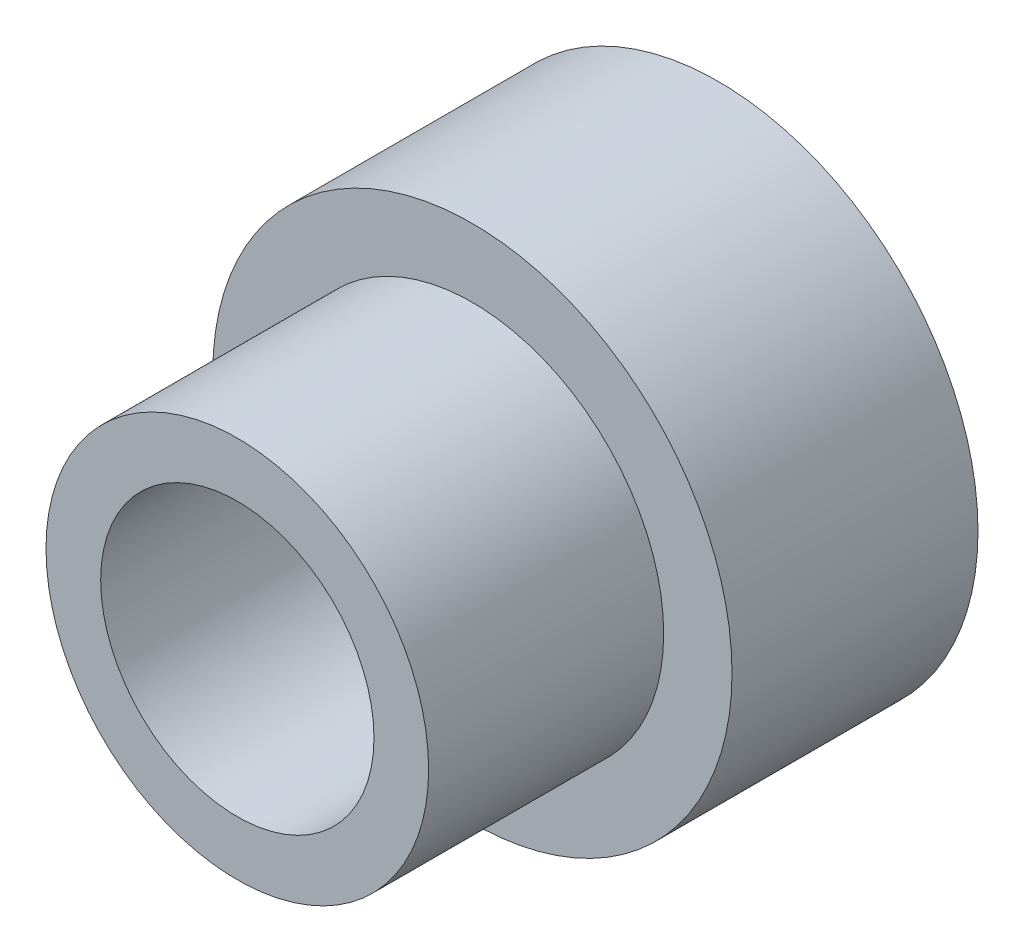
ISO-10303-21;
HEADER;
FILE_DESCRIPTION(('STEP AP214'),'2;1');
FILE_NAME('part.step','',(''),(''),'','','');
FILE_SCHEMA(('AUTOMOTIVE_DESIGN { 1 0 10303 214 1 1 1 1 }'));
ENDSEC;
DATA;
#1=APPLICATION_CONTEXT('core data for automotive mechanical design processes');
#2=APPLICATION_PROTOCOL_DEFINITION('international standard','automotive_design',2000,#1);
#3=PRODUCT_CONTEXT('',#1,'mechanical');
#4=PRODUCT('Part','Part','',(#3));
#5=PRODUCT_RELATED_PRODUCT_CATEGORY('part','',(#4));
#6=PRODUCT_DEFINITION_FORMATION('','',#4);
#7=PRODUCT_DEFINITION_CONTEXT('part definition',#1,'design');
#8=PRODUCT_DEFINITION('design','',#6,#7);
#9=PRODUCT_DEFINITION_SHAPE('','',#8);
#10=(LENGTH_UNIT() NAMED_UNIT(*) SI_UNIT(.MILLI.,.METRE.));
#11=(NAMED_UNIT(*) PLANE_ANGLE_UNIT() SI_UNIT($,.RADIAN.));
#12=(NAMED_UNIT(*) SI_UNIT($,.STERADIAN.) SOLID_ANGLE_UNIT());
#13=UNCERTAINTY_MEASURE_WITH_UNIT(LENGTH_MEASURE(1.E-05),#10,'distance_accuracy_value','');
#14=(GEOMETRIC_REPRESENTATION_CONTEXT(3) GLOBAL_UNCERTAINTY_ASSIGNED_CONTEXT((#13)) GLOBAL_UNIT_ASSIGNED_CONTEXT((#10,
#11,#12)) REPRESENTATION_CONTEXT('',''));
#15=CARTESIAN_POINT('',(0.,0.,0.));
#16=DIRECTION('',(0.,0.,1.));
#17=DIRECTION('',(1.,0.,0.));
#18=AXIS2_PLACEMENT_3D('',#15,#16,#17);
#19=CARTESIAN_POINT('',(0.,0.,8.8));
#20=DIRECTION('',(0.,0.,-1.));
#21=DIRECTION('',(-1.,0.,0.));
#22=AXIS2_PLACEMENT_3D('',#19,#20,#21);
#23=CYLINDRICAL_SURFACE('',#22,4.75);
#24=CARTESIAN_POINT('',(-4.75,0.,3.49964366117878));
#25=CARTESIAN_POINT('',(-4.74999891000432,-0.0690442514355837,3.49799297098812));
#26=CARTESIAN_POINT('',(-4.74847974099882,-0.137970502863256,3.49060434640745));
#27=CARTESIAN_POINT('',(-4.74260231474112,-0.273564940427279,3.46459568027942));
#28=CARTESIAN_POINT('',(-4.73824254619214,-0.340231904670816,3.44596966044144));
#29=CARTESIAN_POINT('',(-4.72719984845734,-0.46933605010888,3.3981284727636));
#30=CARTESIAN_POINT('',(-4.72052000528746,-0.531778719025767,3.36892736903786));
#31=CARTESIAN_POINT('',(-4.70557556407437,-0.650897195168484,3.30080506216222));
#32=CARTESIAN_POINT('',(-4.69731088002504,-0.707572689165806,3.26188333145892));
#33=CARTESIAN_POINT('',(-4.67990733295633,-0.814853006896146,3.17446577887383));
#34=CARTESIAN_POINT('',(-4.67075383533434,-0.86530660605783,3.12578724510292));
#35=CARTESIAN_POINT('',(-4.65274638055937,-0.95742313979145,3.02066519897272));
#36=CARTESIAN_POINT('',(-4.64389245609363,-0.999085117666456,2.96422084264598));
#37=CARTESIAN_POINT('',(-4.62738216207192,-1.07298326458697,2.84417781481729));
#38=CARTESIAN_POINT('',(-4.61974436693425,-1.10507876962353,2.7804897636522));
#39=CARTESIAN_POINT('',(-4.60675808448116,-1.15802805984088,2.64838214603508));
#40=CARTESIAN_POINT('',(-4.60140914403866,-1.17888407032908,2.57996351921861));
#41=CARTESIAN_POINT('',(-4.59377937834712,-1.20827073429202,2.4421027225414));
#42=CARTESIAN_POINT('',(-4.59142721096501,-1.21708835885798,2.37272574081345));
#43=CARTESIAN_POINT('',(-4.58985185848074,-1.22301710532177,2.23344360430024));
#44=CARTESIAN_POINT('',(-4.59062816410688,-1.22013013256405,2.16353853732899));
#45=CARTESIAN_POINT('',(-4.59515077132983,-1.20298059397002,2.02704075179432));
#46=CARTESIAN_POINT('',(-4.59882176289799,-1.18900642360233,1.96040895268843));
#47=CARTESIAN_POINT('',(-4.6086036450214,-1.15050578316468,1.83045897549149));
#48=CARTESIAN_POINT('',(-4.61471476192335,-1.12597833415329,1.76714110541786));
#49=CARTESIAN_POINT('',(-4.62877827125725,-1.0666996175293,1.64460685374193));
#50=CARTESIAN_POINT('',(-4.6367552762614,-1.03180983828533,1.58546041760137));
#51=CARTESIAN_POINT('',(-4.65360904096037,-0.952914538786377,1.47373618464245));
#52=CARTESIAN_POINT('',(-4.66248597333612,-0.908907267340728,1.42115965281582));
#53=CARTESIAN_POINT('',(-4.68045457487104,-0.811401979411775,1.32235505805912));
#54=CARTESIAN_POINT('',(-4.68954430819622,-0.757650800332188,1.27637609014341));
#55=CARTESIAN_POINT('',(-4.70662523276125,-0.643062574426104,1.19404066572519));
#56=CARTESIAN_POINT('',(-4.71461640844014,-0.582225427250045,1.15768434551989));
#57=CARTESIAN_POINT('',(-4.72858748950934,-0.455030633582151,1.0956431556623));
#58=CARTESIAN_POINT('',(-4.73456534999075,-0.388667459139005,1.06996912974381));
#59=CARTESIAN_POINT('',(-4.74378155207311,-0.252378567161095,1.03020221193939));
#60=CARTESIAN_POINT('',(-4.74702048926213,-0.182453627652324,1.01610680226349));
#61=CARTESIAN_POINT('',(-4.75029918246828,-0.0432080622062993,1.00022839429106));
#62=CARTESIAN_POINT('',(-4.75042912181888,0.0260711316400462,0.99809969015378));
#63=CARTESIAN_POINT('',(-4.74766995281537,0.163965624258031,1.00530111233283));
#64=CARTESIAN_POINT('',(-4.74478109584352,0.232580977829043,1.01463028453623));
#65=CARTESIAN_POINT('',(-4.73632914813385,0.366208905396595,1.04421080126813));
#66=CARTESIAN_POINT('',(-4.73080448320104,0.43125872459454,1.06430570080481));
#67=CARTESIAN_POINT('',(-4.71764702440442,0.557055046472667,1.1146832591216));
#68=CARTESIAN_POINT('',(-4.71001397950216,0.61780103562586,1.1449671311657));
#69=CARTESIAN_POINT('',(-4.69321741205471,0.734693363027422,1.21560417314434));
#70=CARTESIAN_POINT('',(-4.68402472614515,0.790714006452704,1.2561582779603));
#71=CARTESIAN_POINT('',(-4.66517074212523,0.895270601613873,1.34589785749307));
#72=CARTESIAN_POINT('',(-4.65550935626212,0.94380514459333,1.39508495307734));
#73=CARTESIAN_POINT('',(-4.636476746808,1.03331292918191,1.50222723845445));
#74=CARTESIAN_POINT('',(-4.62711966293772,1.07405594855623,1.56037765206571));
#75=CARTESIAN_POINT('',(-4.61002769716132,1.14520263261106,1.68291380579634));
#76=CARTESIAN_POINT('',(-4.60229270182805,1.1756070203295,1.74729910947044));
#77=CARTESIAN_POINT('',(-4.58941989817137,1.22489697823498,1.87992398952328));
#78=CARTESIAN_POINT('',(-4.58425926647332,1.24388409081398,1.94812350873291));
#79=CARTESIAN_POINT('',(-4.57706442915304,1.27010639584556,2.08690071739952));
#80=CARTESIAN_POINT('',(-4.57502946830664,1.27734442713368,2.1574778281701));
#81=CARTESIAN_POINT('',(-4.57435058425785,1.27977206783591,2.29659766214816));
#82=CARTESIAN_POINT('',(-4.57560072326222,1.27533806837593,2.36513358743603));
#83=CARTESIAN_POINT('',(-4.58111857816932,1.25537164460877,2.50043988412651));
#84=CARTESIAN_POINT('',(-4.58538627983532,1.23983927266324,2.56721026385736));
#85=CARTESIAN_POINT('',(-4.59642160258139,1.19827558420131,2.69686410562288));
#86=CARTESIAN_POINT('',(-4.60317891521233,1.17228752012647,2.75976236453443));
#87=CARTESIAN_POINT('',(-4.61845271329504,1.11058569371893,2.88035887729869));
#88=CARTESIAN_POINT('',(-4.6269694812077,1.07487036948977,2.93805629407544));
#89=CARTESIAN_POINT('',(-4.64513910633576,0.993463158836126,3.0484713920328));
#90=CARTESIAN_POINT('',(-4.65481836189149,0.947504360484621,3.1009880132408));
#91=CARTESIAN_POINT('',(-4.6740646125765,0.847472643993664,3.19766955315449));
#92=CARTESIAN_POINT('',(-4.68363158158507,0.793397876687111,3.24183256335144));
#93=CARTESIAN_POINT('',(-4.70181157432806,0.677471840700378,3.32132593969066));
#94=CARTESIAN_POINT('',(-4.7104041538435,0.61549733788172,3.3564816171918));
#95=CARTESIAN_POINT('',(-4.72548907902328,0.486282548930466,3.41579787515038));
#96=CARTESIAN_POINT('',(-4.73198286268575,0.419045907573168,3.43996598841665));
#97=CARTESIAN_POINT('',(-4.74128310580491,0.293255132072887,3.47334079838062));
#98=CARTESIAN_POINT('',(-4.74453428611579,0.235223142591517,3.48441783916297));
#99=CARTESIAN_POINT('',(-4.74889310931479,0.11809864823881,3.49827427553013));
#100=CARTESIAN_POINT('',(-4.75000093152634,0.0590062325052679,3.50105436528751));
#101=CARTESIAN_POINT('',(-4.75,0.,3.49964366117878));
#102=B_SPLINE_CURVE_WITH_KNOTS('',3,(#24,#25,#26,#27,#28,#29,#30,#31,#32,#33,#34,#35,#36,#37,
#38,#39,#40,#41,#42,#43,#44,#45,#46,#47,#48,#49,#50,#51,#52,#53,#54,#55,#56,#57,#58,#59,#60,#61,
#62,#63,#64,#65,#66,#67,#68,#69,#70,#71,#72,#73,#74,#75,#76,#77,#78,#79,#80,#81,#82,#83,#84,#85,
#86,#87,#88,#89,#90,#91,#92,#93,#94,#95,#96,#97,#98,#99,#100,#101),.UNSPECIFIED.,.T.,.F.,(4,2,2,
2,2,2,2,2,2,2,2,2,2,2,2,2,2,2,2,2,2,2,2,2,2,2,2,2,2,2,2,2,2,2,2,2,2,2,4),(0.,0.206974816467836,
0.414059840684983,0.620870461814539,0.82769230931525,1.03882671072749,1.24998407577562,
1.46410834560227,1.67819020537716,1.88707403601082,2.09592386464908,2.29951254149228,
2.50312010766633,2.70958214131317,2.91608386680906,3.12902507219085,3.34196929355507,
3.55512915303268,3.76824264825396,3.9751665788995,4.18207327987629,4.38605172678111,
4.59005447126304,4.79840708307695,5.00679885558828,5.2206257318427,5.43443765091882,
5.64631871834405,5.85814858303511,6.06323182538042,6.2683141001584,6.47255658616519,
6.67683188653836,6.88722915849408,7.0976744409828,7.3119358338155,7.52605011187363,
7.70294863419355,7.8798323557099),.UNSPECIFIED.);
#103=CARTESIAN_POINT('',(-4.75,0.,3.49964366117878));
#104=VERTEX_POINT('',#103);
#105=EDGE_CURVE('E58',#104,#104,#102,.T.);
#106=ORIENTED_EDGE('',*,*,#105,.T.);
#107=EDGE_LOOP('',(#106));
#108=FACE_BOUND('',#107,.T.);
#109=CARTESIAN_POINT('',(0.,0.,0.));
#110=DIRECTION('',(0.,0.,1.));
#111=DIRECTION('',(1.,0.,0.));
#112=AXIS2_PLACEMENT_3D('',#109,#110,#111);
#113=CIRCLE('',#112,4.75);
#114=CARTESIAN_POINT('',(4.75,0.,0.));
#115=VERTEX_POINT('',#114);
#116=EDGE_CURVE('E10',#115,#115,#113,.T.);
#117=ORIENTED_EDGE('',*,*,#116,.T.);
#118=EDGE_LOOP('',(#117));
#119=FACE_BOUND('',#118,.T.);
#120=CARTESIAN_POINT('',(0.,0.,4.5));
#121=DIRECTION('',(0.,0.,1.));
#122=DIRECTION('',(1.,0.,0.));
#123=AXIS2_PLACEMENT_3D('',#120,#121,#122);
#124=CIRCLE('',#123,4.75);
#125=CARTESIAN_POINT('',(4.75,0.,4.5));
#126=VERTEX_POINT('',#125);
#127=EDGE_CURVE('E42',#126,#126,#124,.T.);
#128=ORIENTED_EDGE('',*,*,#127,.F.);
#129=EDGE_LOOP('',(#128));
#130=FACE_BOUND('',#129,.T.);
#131=ADVANCED_FACE('F30',(#108,#119,#130),#23,.T.);
#132=CARTESIAN_POINT('',(0.,0.,0.));
#133=DIRECTION('',(0.,0.,1.));
#134=DIRECTION('',(1.,0.,0.));
#135=AXIS2_PLACEMENT_3D('',#132,#133,#134);
#136=PLANE('',#135);
#137=CARTESIAN_POINT('',(0.,0.,0.));
#138=DIRECTION('',(0.,0.,-1.));
#139=DIRECTION('',(-1.,0.,0.));
#140=AXIS2_PLACEMENT_3D('',#137,#138,#139);
#141=CIRCLE('',#140,2.5);
#142=CARTESIAN_POINT('',(-2.5,0.,0.));
#143=VERTEX_POINT('',#142);
#144=EDGE_CURVE('E55',#143,#143,#141,.T.);
#145=ORIENTED_EDGE('',*,*,#144,.F.);
#146=EDGE_LOOP('',(#145));
#147=FACE_BOUND('',#146,.T.);
#148=ORIENTED_EDGE('',*,*,#116,.F.);
#149=EDGE_LOOP('',(#148));
#150=FACE_BOUND('',#149,.T.);
#151=ADVANCED_FACE('F82',(#147,#150),#136,.F.);
#152=CARTESIAN_POINT('',(0.,0.,4.5));
#153=DIRECTION('',(0.,0.,1.));
#154=DIRECTION('',(1.,0.,0.));
#155=AXIS2_PLACEMENT_3D('',#152,#153,#154);
#156=PLANE('',#155);
#157=CARTESIAN_POINT('',(0.,0.,4.5));
#158=DIRECTION('',(0.,0.,1.));
#159=DIRECTION('',(1.,0.,0.));
#160=AXIS2_PLACEMENT_3D('',#157,#158,#159);
#161=CIRCLE('',#160,3.5);
#162=CARTESIAN_POINT('',(3.5,0.,4.5));
#163=VERTEX_POINT('',#162);
#164=EDGE_CURVE('E46',#163,#163,#161,.T.);
#165=ORIENTED_EDGE('',*,*,#164,.F.);
#166=EDGE_LOOP('',(#165));
#167=FACE_BOUND('',#166,.T.);
#168=ORIENTED_EDGE('',*,*,#127,.T.);
#169=EDGE_LOOP('',(#168));
#170=FACE_BOUND('',#169,.T.);
#171=ADVANCED_FACE('F78',(#167,#170),#156,.T.);
#172=CARTESIAN_POINT('',(0.,0.,4.5));
#173=DIRECTION('',(0.,0.,1.));
#174=DIRECTION('',(1.,0.,0.));
#175=AXIS2_PLACEMENT_3D('',#172,#173,#174);
#176=CYLINDRICAL_SURFACE('',#175,3.5);
#177=CARTESIAN_POINT('',(0.,0.,8.8));
#178=DIRECTION('',(0.,0.,1.));
#179=DIRECTION('',(1.,0.,0.));
#180=AXIS2_PLACEMENT_3D('',#177,#178,#179);
#181=CIRCLE('',#180,3.5);
#182=CARTESIAN_POINT('',(3.5,0.,8.8));
#183=VERTEX_POINT('',#182);
#184=EDGE_CURVE('E49',#183,#183,#181,.T.);
#185=CARTESIAN_POINT('',(3.5,0.,4.5));
#186=CARTESIAN_POINT('',(3.5,0.,4.54479166666667));
#187=CARTESIAN_POINT('',(3.5,0.,4.58958333333333));
#188=CARTESIAN_POINT('',(3.5,0.,4.67916666666667));
#189=CARTESIAN_POINT('',(3.5,0.,4.72395833333333));
#190=CARTESIAN_POINT('',(3.5,0.,4.81354166666667));
#191=CARTESIAN_POINT('',(3.5,0.,4.85833333333333));
#192=CARTESIAN_POINT('',(3.5,0.,4.94791666666667));
#193=CARTESIAN_POINT('',(3.5,0.,4.99270833333333));
#194=CARTESIAN_POINT('',(3.5,0.,5.08229166666667));
#195=CARTESIAN_POINT('',(3.5,0.,5.12708333333333));
#196=CARTESIAN_POINT('',(3.5,0.,5.21666666666667));
#197=CARTESIAN_POINT('',(3.5,0.,5.26145833333333));
#198=CARTESIAN_POINT('',(3.5,0.,5.35104166666667));
#199=CARTESIAN_POINT('',(3.5,0.,5.39583333333333));
#200=CARTESIAN_POINT('',(3.5,0.,5.48541666666667));
#201=CARTESIAN_POINT('',(3.5,0.,5.53020833333333));
#202=CARTESIAN_POINT('',(3.5,0.,5.61979166666667));
#203=CARTESIAN_POINT('',(3.5,0.,5.66458333333333));
#204=CARTESIAN_POINT('',(3.5,0.,5.75416666666667));
#205=CARTESIAN_POINT('',(3.5,0.,5.79895833333333));
#206=CARTESIAN_POINT('',(3.5,0.,5.88854166666667));
#207=CARTESIAN_POINT('',(3.5,0.,5.93333333333333));
#208=CARTESIAN_POINT('',(3.5,0.,6.02291666666667));
#209=CARTESIAN_POINT('',(3.5,0.,6.06770833333333));
#210=CARTESIAN_POINT('',(3.5,0.,6.15729166666667));
#211=CARTESIAN_POINT('',(3.5,0.,6.20208333333333));
#212=CARTESIAN_POINT('',(3.5,0.,6.29166666666667));
#213=CARTESIAN_POINT('',(3.5,0.,6.33645833333333));
#214=CARTESIAN_POINT('',(3.5,0.,6.42604166666667));
#215=CARTESIAN_POINT('',(3.5,0.,6.47083333333333));
#216=CARTESIAN_POINT('',(3.5,0.,6.56041666666667));
#217=CARTESIAN_POINT('',(3.5,0.,6.60520833333333));
#218=CARTESIAN_POINT('',(3.5,0.,6.69479166666667));
#219=CARTESIAN_POINT('',(3.5,0.,6.73958333333333));
#220=CARTESIAN_POINT('',(3.5,0.,6.82916666666667));
#221=CARTESIAN_POINT('',(3.5,0.,6.87395833333333));
#222=CARTESIAN_POINT('',(3.5,0.,6.96354166666667));
#223=CARTESIAN_POINT('',(3.5,0.,7.00833333333333));
#224=CARTESIAN_POINT('',(3.5,0.,7.09791666666667));
#225=CARTESIAN_POINT('',(3.5,0.,7.14270833333333));
#226=CARTESIAN_POINT('',(3.5,0.,7.23229166666667));
#227=CARTESIAN_POINT('',(3.5,0.,7.27708333333333));
#228=CARTESIAN_POINT('',(3.5,0.,7.36666666666667));
#229=CARTESIAN_POINT('',(3.5,0.,7.41145833333333));
#230=CARTESIAN_POINT('',(3.5,0.,7.50104166666667));
#231=CARTESIAN_POINT('',(3.5,0.,7.54583333333333));
#232=CARTESIAN_POINT('',(3.5,0.,7.63541666666667));
#233=CARTESIAN_POINT('',(3.5,0.,7.68020833333333));
#234=CARTESIAN_POINT('',(3.5,0.,7.76979166666667));
#235=CARTESIAN_POINT('',(3.5,0.,7.81458333333333));
#236=CARTESIAN_POINT('',(3.5,0.,7.90416666666667));
#237=CARTESIAN_POINT('',(3.5,0.,7.94895833333333));
#238=CARTESIAN_POINT('',(3.5,0.,8.03854166666667));
#239=CARTESIAN_POINT('',(3.5,0.,8.08333333333333));
#240=CARTESIAN_POINT('',(3.5,0.,8.17291666666667));
#241=CARTESIAN_POINT('',(3.5,0.,8.21770833333333));
#242=CARTESIAN_POINT('',(3.5,0.,8.30729166666667));
#243=CARTESIAN_POINT('',(3.5,0.,8.35208333333333));
#244=CARTESIAN_POINT('',(3.5,0.,8.44166666666667));
#245=CARTESIAN_POINT('',(3.5,0.,8.48645833333333));
#246=CARTESIAN_POINT('',(3.5,0.,8.57604166666667));
#247=CARTESIAN_POINT('',(3.5,0.,8.62083333333333));
#248=CARTESIAN_POINT('',(3.5,0.,8.71041666666667));
#249=CARTESIAN_POINT('',(3.5,0.,8.75520833333333));
#250=CARTESIAN_POINT('',(3.5,0.,8.8));
#251=B_SPLINE_CURVE_WITH_KNOTS('',3,(#185,#186,#187,#188,#189,#190,#191,#192,#193,#194,#195,
#196,#197,#198,#199,#200,#201,#202,#203,#204,#205,#206,#207,#208,#209,#210,#211,#212,#213,#214,
#215,#216,#217,#218,#219,#220,#221,#222,#223,#224,#225,#226,#227,#228,#229,#230,#231,#232,#233,
#234,#235,#236,#237,#238,#239,#240,#241,#242,#243,#244,#245,#246,#247,#248,#249,#250),
.UNSPECIFIED.,.F.,.F.,(4,2,2,2,2,2,2,2,2,2,2,2,2,2,2,2,2,2,2,2,2,2,2,2,2,2,2,2,2,2,2,2,4),(0.,
0.134375,0.26875,0.403125,0.5375,0.671875,0.80625,0.940625,1.075,1.209375,1.34375,1.478125,
1.6125,1.746875,1.88125,2.015625,2.15,2.284375,2.41875,2.553125,2.6875,2.821875,2.95625,
3.090625,3.225,3.359375,3.49375,3.628125,3.7625,3.896875,4.03125,4.165625,4.3),.UNSPECIFIED.);
#252=EDGE_CURVE('BSEAM75',#163,#183,#251,.T.);
#253=ORIENTED_EDGE('',*,*,#164,.T.);
#254=ORIENTED_EDGE('',*,*,#184,.F.);
#255=ORIENTED_EDGE('',*,*,#252,.T.);
#256=ORIENTED_EDGE('',*,*,#252,.F.);
#257=EDGE_LOOP('',(#253,#255,#254,#256));
#258=FACE_BOUND('',#257,.T.);
#259=ADVANCED_FACE('F75',(#258),#176,.T.);
#260=CARTESIAN_POINT('',(0.,0.,8.8));
#261=DIRECTION('',(0.,0.,1.));
#262=DIRECTION('',(1.,0.,0.));
#263=AXIS2_PLACEMENT_3D('',#260,#261,#262);
#264=PLANE('',#263);
#265=CARTESIAN_POINT('',(0.,0.,8.8));
#266=DIRECTION('',(0.,0.,-1.));
#267=DIRECTION('',(-1.,0.,0.));
#268=AXIS2_PLACEMENT_3D('',#265,#266,#267);
#269=CIRCLE('',#268,2.5);
#270=CARTESIAN_POINT('',(-2.5,0.,8.8));
#271=VERTEX_POINT('',#270);
#272=EDGE_CURVE('E52',#271,#271,#269,.T.);
#273=ORIENTED_EDGE('',*,*,#272,.T.);
#274=EDGE_LOOP('',(#273));
#275=FACE_BOUND('',#274,.T.);
#276=ORIENTED_EDGE('',*,*,#184,.T.);
#277=EDGE_LOOP('',(#276));
#278=FACE_BOUND('',#277,.T.);
#279=ADVANCED_FACE('F73',(#275,#278),#264,.T.);
#280=CARTESIAN_POINT('',(0.,0.,8.8));
#281=DIRECTION('',(0.,0.,-1.));
#282=DIRECTION('',(-1.,0.,0.));
#283=AXIS2_PLACEMENT_3D('',#280,#281,#282);
#284=CYLINDRICAL_SURFACE('',#283,2.5);
#285=CARTESIAN_POINT('',(-2.5,0.,3.4999013013582));
#286=CARTESIAN_POINT('',(-2.49999641787918,0.0655244964583082,3.50072062189757));
#287=CARTESIAN_POINT('',(-2.49739642895794,0.131190881601952,3.49636694862987));
#288=CARTESIAN_POINT('',(-2.48722086606118,0.26071533681036,3.47749289677184));
#289=CARTESIAN_POINT('',(-2.47963615147796,0.32456985959421,3.46295383776554));
#290=CARTESIAN_POINT('',(-2.4602547213889,0.448397288812737,3.42442210807163));
#291=CARTESIAN_POINT('',(-2.44847382815021,0.50838379004388,3.40046491502815));
#292=CARTESIAN_POINT('',(-2.42175636599082,0.623366118524366,3.3439768560715));
#293=CARTESIAN_POINT('',(-2.40682001377111,0.678362288113915,3.31144657887651));
#294=CARTESIAN_POINT('',(-2.37410834103402,0.78544585089068,3.23657773677057));
#295=CARTESIAN_POINT('',(-2.35621790414629,0.837173559573563,3.19377587326042));
#296=CARTESIAN_POINT('',(-2.31992116881156,0.933059017760903,3.10053651512305));
#297=CARTESIAN_POINT('',(-2.30151449373486,0.977211063874992,3.05009332099281));
#298=CARTESIAN_POINT('',(-2.26450160688225,1.06031430168917,2.93811603803585));
#299=CARTESIAN_POINT('',(-2.24600039100354,1.09855280211433,2.87601413446858));
#300=CARTESIAN_POINT('',(-2.21282358827217,1.16394332329908,2.74527781056667));
#301=CARTESIAN_POINT('',(-2.19814569366599,1.19110203744026,2.67664736517003));
#302=CARTESIAN_POINT('',(-2.17549221857354,1.23197291761182,2.53845459005825));
#303=CARTESIAN_POINT('',(-2.16720238830697,1.24632199028859,2.46913484372284));
#304=CARTESIAN_POINT('',(-2.15746842893806,1.26310469764839,2.32862382876361));
#305=CARTESIAN_POINT('',(-2.15601694845427,1.26555112803503,2.25743465267621));
#306=CARTESIAN_POINT('',(-2.15993373284504,1.25884440550886,2.12456270351741));
#307=CARTESIAN_POINT('',(-2.16449177676993,1.25106967571836,2.06277950506379));
#308=CARTESIAN_POINT('',(-2.17842929463424,1.22663825296095,1.94156140623131));
#309=CARTESIAN_POINT('',(-2.18781026627953,1.2099788008836,1.88212724149605));
#310=CARTESIAN_POINT('',(-2.21044295694306,1.16812308118952,1.76609436298961));
#311=CARTESIAN_POINT('',(-2.22375198682888,1.14279946300203,1.70955331439503));
#312=CARTESIAN_POINT('',(-2.25278827307131,1.08443813107083,1.60128528126553));
#313=CARTESIAN_POINT('',(-2.26851656571045,1.05139710844498,1.54956037502224));
#314=CARTESIAN_POINT('',(-2.30303891840378,0.973672050120659,1.44550643932181));
#315=CARTESIAN_POINT('',(-2.32196938285135,0.92804489296716,1.39392495962425));
#316=CARTESIAN_POINT('',(-2.35922103862622,0.828786413955799,1.29882729946938));
#317=CARTESIAN_POINT('',(-2.37754191158333,0.775150987449553,1.25531528081761));
#318=CARTESIAN_POINT('',(-2.41271223512403,0.657843969956093,1.1753920791324));
#319=CARTESIAN_POINT('',(-2.42943262466502,0.593791619294811,1.13947813509973));
#320=CARTESIAN_POINT('',(-2.45836171154674,0.45952056072862,1.07922206375283));
#321=CARTESIAN_POINT('',(-2.47057381906919,0.389306563621328,1.05487118582641));
#322=CARTESIAN_POINT('',(-2.48830688102563,0.250642722992025,1.02037678549208));
#323=CARTESIAN_POINT('',(-2.49428115986218,0.182493560515833,1.00926081259956));
#324=CARTESIAN_POINT('',(-2.50053860701548,0.0450487556870986,0.998446395893576));
#325=CARTESIAN_POINT('',(-2.50082470457567,-0.0242462781735562,0.998742075189383));
#326=CARTESIAN_POINT('',(-2.49592702800473,-0.156035066943597,1.01022910543365));
#327=CARTESIAN_POINT('',(-2.49118405294468,-0.218625393202112,1.02053674074606));
#328=CARTESIAN_POINT('',(-2.4773897456308,-0.341083824768653,1.05030336991299));
#329=CARTESIAN_POINT('',(-2.46833798954509,-0.400951661645076,1.0697632640243));
#330=CARTESIAN_POINT('',(-2.44650184721553,-0.51793433748314,1.1176667215702));
#331=CARTESIAN_POINT('',(-2.43363408406667,-0.574950306865459,1.14631226229624));
#332=CARTESIAN_POINT('',(-2.40539128763999,-0.68355414526693,1.21154435153647));
#333=CARTESIAN_POINT('',(-2.39001524686957,-0.735139819359562,1.24813409293723));
#334=CARTESIAN_POINT('',(-2.35647955814078,-0.836741704636031,1.33231398454555));
#335=CARTESIAN_POINT('',(-2.33819461432812,-0.886117968745219,1.38062768786899));
#336=CARTESIAN_POINT('',(-2.30197049053877,-0.976371712980453,1.48480198583723));
#337=CARTESIAN_POINT('',(-2.28403156981578,-1.01724302939055,1.54066800577071));
#338=CARTESIAN_POINT('',(-2.24957028471191,-1.09141983389096,1.66210832109736));
#339=CARTESIAN_POINT('',(-2.23317597265965,-1.12420027230785,1.72804313075633));
#340=CARTESIAN_POINT('',(-2.20535282890496,-1.17785577739228,1.86555028249036));
#341=CARTESIAN_POINT('',(-2.1939179683166,-1.19874530878189,1.93711565405225));
#342=CARTESIAN_POINT('',(-2.17870785806088,-1.22615572429347,2.07694391888215));
#343=CARTESIAN_POINT('',(-2.17433212632229,-1.23380766407749,2.14491791981865));
#344=CARTESIAN_POINT('',(-2.17203907304914,-1.23784307849482,2.28129408051491));
#345=CARTESIAN_POINT('',(-2.17411837484399,-1.23423244464991,2.34969599774554));
#346=CARTESIAN_POINT('',(-2.18385104524061,-1.21691134028526,2.4777116353777));
#347=CARTESIAN_POINT('',(-2.19092354763328,-1.20425177731009,2.53751796524111));
#348=CARTESIAN_POINT('',(-2.20909449829088,-1.1705832053046,2.65408208243197));
#349=CARTESIAN_POINT('',(-2.22019425142755,-1.14957148987762,2.71083887482622));
#350=CARTESIAN_POINT('',(-2.24597051701021,-1.09839973403535,2.82351607993992));
#351=CARTESIAN_POINT('',(-2.2608226018601,-1.06776370073913,2.87917881486552));
#352=CARTESIAN_POINT('',(-2.29216496975955,-0.998707729484282,2.98493883821842));
#353=CARTESIAN_POINT('',(-2.30865607167094,-0.960283890631704,3.03503331797099));
#354=CARTESIAN_POINT('',(-2.34383779581842,-0.871199377768762,3.13467682831682));
#355=CARTESIAN_POINT('',(-2.36254877009391,-0.819613853969502,3.18339608217809));
#356=CARTESIAN_POINT('',(-2.39819928571235,-0.708547772191328,3.27172517243595));
#357=CARTESIAN_POINT('',(-2.41513776482464,-0.649062527924951,3.31132956328393));
#358=CARTESIAN_POINT('',(-2.44563888959625,-0.522624750537508,3.38063390442058));
#359=CARTESIAN_POINT('',(-2.45915152658598,-0.455580199725176,3.41018906919188));
#360=CARTESIAN_POINT('',(-2.48084963474802,-0.316681883111207,3.45724254177125));
#361=CARTESIAN_POINT('',(-2.48905020964529,-0.24484239885555,3.47477504188919));
#362=CARTESIAN_POINT('',(-2.49604254754095,-0.143500980576229,3.49015809668702));
#363=CARTESIAN_POINT('',(-2.49752198565862,-0.114924745426348,3.49349003303246));
#364=CARTESIAN_POINT('',(-2.4995015185056,-0.0575748164099673,3.49818160929985));
#365=CARTESIAN_POINT('',(-2.50000157451149,-0.0288011147810536,3.49954117123631));
#366=CARTESIAN_POINT('',(-2.5,0.,3.4999013013582));
#367=B_SPLINE_CURVE_WITH_KNOTS('',3,(#285,#286,#287,#288,#289,#290,#291,#292,#293,#294,#295,
#296,#297,#298,#299,#300,#301,#302,#303,#304,#305,#306,#307,#308,#309,#310,#311,#312,#313,#314,
#315,#316,#317,#318,#319,#320,#321,#322,#323,#324,#325,#326,#327,#328,#329,#330,#331,#332,#333,
#334,#335,#336,#337,#338,#339,#340,#341,#342,#343,#344,#345,#346,#347,#348,#349,#350,#351,#352,
#353,#354,#355,#356,#357,#358,#359,#360,#361,#362,#363,#364,#365,#366),.UNSPECIFIED.,.T.,.F.,(4,
2,2,2,2,2,2,2,2,2,2,2,2,2,2,2,2,2,2,2,2,2,2,2,2,2,2,2,2,2,2,2,2,2,2,2,2,2,2,2,4),(0.,
0.1964724588392,0.393306202825849,0.58940548127426,0.785491296989911,0.993075612167283,
1.20081552937579,1.42541163380359,1.64987185641563,1.86242446196128,2.0747485164053,
2.26117508344243,2.44765957814939,2.63701208929869,2.82644593595593,3.03978628071126,
3.2532363510995,3.47797501817732,3.70254333705368,3.90932644784914,4.11600306876031,
4.30595349561549,4.49592261074656,4.69039387033786,4.88494343584517,5.09840358958499,
5.31201790775591,5.537119471624,5.7619466217551,5.96638902836019,6.17072450781869,
6.35453549022503,6.53840608259279,6.7333849109131,6.92846164612306,7.14760558504599,
7.36688011056788,7.58919182749079,7.81086864084955,7.89722416318593,7.98358309983101),.UNSPECIFIED.);
#368=CARTESIAN_POINT('',(-2.5,0.,3.4999013013582));
#369=VERTEX_POINT('',#368);
#370=EDGE_CURVE('E34',#369,#369,#367,.T.);
#371=ORIENTED_EDGE('',*,*,#370,.T.);
#372=EDGE_LOOP('',(#371));
#373=FACE_BOUND('',#372,.T.);
#374=ORIENTED_EDGE('',*,*,#272,.F.);
#375=EDGE_LOOP('',(#374));
#376=FACE_BOUND('',#375,.T.);
#377=ORIENTED_EDGE('',*,*,#144,.T.);
#378=EDGE_LOOP('',(#377));
#379=FACE_BOUND('',#378,.T.);
#380=ADVANCED_FACE('F67',(#373,#376,#379),#284,.F.);
#381=CARTESIAN_POINT('',(0.249995065214036,-0.00157078599138974,2.25));
#382=DIRECTION('',(-0.999980260856137,0.00628314396555895,0.));
#383=DIRECTION('',(-0.00628314396555895,-0.999980260856137,0.));
#384=AXIS2_PLACEMENT_3D('',#381,#382,#383);
#385=CYLINDRICAL_SURFACE('',#384,1.25);
#386=ORIENTED_EDGE('',*,*,#370,.F.);
#387=EDGE_LOOP('',(#386));
#388=FACE_BOUND('',#387,.T.);
#389=ORIENTED_EDGE('',*,*,#105,.F.);
#390=EDGE_LOOP('',(#389));
#391=FACE_BOUND('',#390,.T.);
#392=ADVANCED_FACE('F64',(#388,#391),#385,.F.);
#393=CLOSED_SHELL('',(#131,#151,#171,#259,#279,#380,#392));
#394=MANIFOLD_SOLID_BREP('B2',#393);
#395=ADVANCED_BREP_SHAPE_REPRESENTATION('',(#18,#394),#14);
#396=SHAPE_DEFINITION_REPRESENTATION(#9,#395);
ENDSEC;
END-ISO-10303-21;
